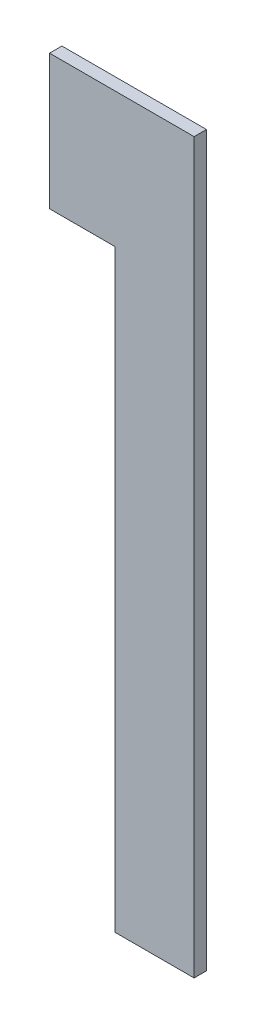
ISO-10303-21;
HEADER;
FILE_DESCRIPTION(('STEP AP214'),'2;1');
FILE_NAME('part.step','',(''),(''),'','','');
FILE_SCHEMA(('AUTOMOTIVE_DESIGN { 1 0 10303 214 1 1 1 1 }'));
ENDSEC;
DATA;
#1=APPLICATION_CONTEXT('core data for automotive mechanical design processes');
#2=APPLICATION_PROTOCOL_DEFINITION('international standard','automotive_design',2000,#1);
#3=PRODUCT_CONTEXT('',#1,'mechanical');
#4=PRODUCT('Part','Part','',(#3));
#5=PRODUCT_RELATED_PRODUCT_CATEGORY('part','',(#4));
#6=PRODUCT_DEFINITION_FORMATION('','',#4);
#7=PRODUCT_DEFINITION_CONTEXT('part definition',#1,'design');
#8=PRODUCT_DEFINITION('design','',#6,#7);
#9=PRODUCT_DEFINITION_SHAPE('','',#8);
#10=(LENGTH_UNIT() NAMED_UNIT(*) SI_UNIT(.MILLI.,.METRE.));
#11=(NAMED_UNIT(*) PLANE_ANGLE_UNIT() SI_UNIT($,.RADIAN.));
#12=(NAMED_UNIT(*) SI_UNIT($,.STERADIAN.) SOLID_ANGLE_UNIT());
#13=UNCERTAINTY_MEASURE_WITH_UNIT(LENGTH_MEASURE(1.E-05),#10,'distance_accuracy_value','');
#14=(GEOMETRIC_REPRESENTATION_CONTEXT(3) GLOBAL_UNCERTAINTY_ASSIGNED_CONTEXT((#13)) GLOBAL_UNIT_ASSIGNED_CONTEXT((#10,
#11,#12)) REPRESENTATION_CONTEXT('',''));
#15=CARTESIAN_POINT('',(0.,0.,0.));
#16=DIRECTION('',(0.,0.,1.));
#17=DIRECTION('',(1.,0.,0.));
#18=AXIS2_PLACEMENT_3D('',#15,#16,#17);
#19=CARTESIAN_POINT('',(0.,0.,-1.17));
#20=DIRECTION('',(-1.,0.,0.));
#21=DIRECTION('',(0.,0.,1.));
#22=AXIS2_PLACEMENT_3D('',#19,#20,#21);
#23=PLANE('',#22);
#24=DIRECTION('',(0.,-1.,0.));
#25=VECTOR('',#24,1.);
#26=CARTESIAN_POINT('',(0.,0.,0.));
#27=LINE('',#26,#25);
#28=CARTESIAN_POINT('',(0.,56.1944777012527,0.));
#29=VERTEX_POINT('',#28);
#30=CARTESIAN_POINT('',(0.,0.,0.));
#31=VERTEX_POINT('',#30);
#32=EDGE_CURVE('E122',#29,#31,#27,.T.);
#33=ORIENTED_EDGE('',*,*,#32,.F.);
#34=DIRECTION('',(0.,0.,1.));
#35=VECTOR('',#34,1.);
#36=CARTESIAN_POINT('',(0.,56.1944777012527,-1.17));
#37=LINE('',#36,#35);
#38=CARTESIAN_POINT('',(0.,56.1944777012527,-1.17));
#39=VERTEX_POINT('',#38);
#40=EDGE_CURVE('E11',#39,#29,#37,.T.);
#41=ORIENTED_EDGE('',*,*,#40,.F.);
#42=DIRECTION('',(0.,-1.,0.));
#43=VECTOR('',#42,1.);
#44=CARTESIAN_POINT('',(0.,0.,-1.17));
#45=LINE('',#44,#43);
#46=CARTESIAN_POINT('',(0.,0.,-1.17));
#47=VERTEX_POINT('',#46);
#48=EDGE_CURVE('E136',#39,#47,#45,.T.);
#49=ORIENTED_EDGE('',*,*,#48,.T.);
#50=DIRECTION('',(0.,0.,1.));
#51=VECTOR('',#50,1.);
#52=CARTESIAN_POINT('',(0.,0.,-1.17));
#53=LINE('',#52,#51);
#54=EDGE_CURVE('E40',#47,#31,#53,.T.);
#55=ORIENTED_EDGE('',*,*,#54,.T.);
#56=EDGE_LOOP('',(#33,#41,#49,#55));
#57=FACE_BOUND('',#56,.T.);
#58=ADVANCED_FACE('F37',(#57),#23,.T.);
#59=CARTESIAN_POINT('',(0.,56.1944777012527,-1.17));
#60=DIRECTION('',(0.,-1.,0.));
#61=DIRECTION('',(0.,0.,-1.));
#62=AXIS2_PLACEMENT_3D('',#59,#60,#61);
#63=PLANE('',#62);
#64=DIRECTION('',(1.,0.,0.));
#65=VECTOR('',#64,1.);
#66=CARTESIAN_POINT('',(0.,56.1944777012527,0.));
#67=LINE('',#66,#65);
#68=CARTESIAN_POINT('',(-6.18258430921038,56.1944777012527,0.));
#69=VERTEX_POINT('',#68);
#70=EDGE_CURVE('E134',#69,#29,#67,.T.);
#71=ORIENTED_EDGE('',*,*,#70,.F.);
#72=DIRECTION('',(0.,0.,1.));
#73=VECTOR('',#72,1.);
#74=CARTESIAN_POINT('',(-6.18258430921038,56.1944777012527,-1.17));
#75=LINE('',#74,#73);
#76=CARTESIAN_POINT('',(-6.18258430921038,56.1944777012527,-1.17));
#77=VERTEX_POINT('',#76);
#78=EDGE_CURVE('E46',#77,#69,#75,.T.);
#79=ORIENTED_EDGE('',*,*,#78,.F.);
#80=DIRECTION('',(1.,0.,0.));
#81=VECTOR('',#80,1.);
#82=CARTESIAN_POINT('',(0.,56.1944777012527,-1.17));
#83=LINE('',#82,#81);
#84=EDGE_CURVE('E112',#77,#39,#83,.T.);
#85=ORIENTED_EDGE('',*,*,#84,.T.);
#86=ORIENTED_EDGE('',*,*,#40,.T.);
#87=EDGE_LOOP('',(#71,#79,#85,#86));
#88=FACE_BOUND('',#87,.T.);
#89=ADVANCED_FACE('F144',(#88),#63,.T.);
#90=CARTESIAN_POINT('',(-6.18258430921038,56.1944777012527,-1.17));
#91=DIRECTION('',(-1.,0.,0.));
#92=DIRECTION('',(0.,0.,1.));
#93=AXIS2_PLACEMENT_3D('',#90,#91,#92);
#94=PLANE('',#93);
#95=DIRECTION('',(0.,-1.,0.));
#96=VECTOR('',#95,1.);
#97=CARTESIAN_POINT('',(-6.18258430921038,56.1944777012527,0.));
#98=LINE('',#97,#96);
#99=CARTESIAN_POINT('',(-6.18258430921038,68.9500000000013,0.));
#100=VERTEX_POINT('',#99);
#101=EDGE_CURVE('E99',#100,#69,#98,.T.);
#102=ORIENTED_EDGE('',*,*,#101,.F.);
#103=DIRECTION('',(0.,0.,1.));
#104=VECTOR('',#103,1.);
#105=CARTESIAN_POINT('',(-6.18258430921038,68.9500000000013,-1.17));
#106=LINE('',#105,#104);
#107=CARTESIAN_POINT('',(-6.18258430921038,68.9500000000013,-1.17));
#108=VERTEX_POINT('',#107);
#109=EDGE_CURVE('E94',#108,#100,#106,.T.);
#110=ORIENTED_EDGE('',*,*,#109,.F.);
#111=DIRECTION('',(0.,-1.,0.));
#112=VECTOR('',#111,1.);
#113=CARTESIAN_POINT('',(-6.18258430921038,56.1944777012527,-1.17));
#114=LINE('',#113,#112);
#115=EDGE_CURVE('E97',#108,#77,#114,.T.);
#116=ORIENTED_EDGE('',*,*,#115,.T.);
#117=ORIENTED_EDGE('',*,*,#78,.T.);
#118=EDGE_LOOP('',(#102,#110,#116,#117));
#119=FACE_BOUND('',#118,.T.);
#120=ADVANCED_FACE('F96',(#119),#94,.T.);
#121=CARTESIAN_POINT('',(-6.18258430921038,68.9500000000013,-1.17));
#122=DIRECTION('',(0.,1.,0.));
#123=DIRECTION('',(0.,0.,1.));
#124=AXIS2_PLACEMENT_3D('',#121,#122,#123);
#125=PLANE('',#124);
#126=DIRECTION('',(-1.,0.,0.));
#127=VECTOR('',#126,1.);
#128=CARTESIAN_POINT('',(-6.18258430921038,68.9500000000013,0.));
#129=LINE('',#128,#127);
#130=CARTESIAN_POINT('',(7.5,68.9500000000013,0.));
#131=VERTEX_POINT('',#130);
#132=EDGE_CURVE('E131',#131,#100,#129,.T.);
#133=ORIENTED_EDGE('',*,*,#132,.F.);
#134=DIRECTION('',(0.,0.,1.));
#135=VECTOR('',#134,1.);
#136=CARTESIAN_POINT('',(7.5,68.9500000000013,-1.17));
#137=LINE('',#136,#135);
#138=CARTESIAN_POINT('',(7.5,68.9500000000013,-1.17));
#139=VERTEX_POINT('',#138);
#140=EDGE_CURVE('E104',#139,#131,#137,.T.);
#141=ORIENTED_EDGE('',*,*,#140,.F.);
#142=DIRECTION('',(-1.,0.,0.));
#143=VECTOR('',#142,1.);
#144=CARTESIAN_POINT('',(-6.18258430921038,68.9500000000013,-1.17));
#145=LINE('',#144,#143);
#146=EDGE_CURVE('E110',#139,#108,#145,.T.);
#147=ORIENTED_EDGE('',*,*,#146,.T.);
#148=ORIENTED_EDGE('',*,*,#109,.T.);
#149=EDGE_LOOP('',(#133,#141,#147,#148));
#150=FACE_BOUND('',#149,.T.);
#151=ADVANCED_FACE('F114',(#150),#125,.T.);
#152=CARTESIAN_POINT('',(7.5,0.,-1.17));
#153=DIRECTION('',(1.,0.,0.));
#154=DIRECTION('',(0.,0.,-1.));
#155=AXIS2_PLACEMENT_3D('',#152,#153,#154);
#156=PLANE('',#155);
#157=DIRECTION('',(0.,1.,0.));
#158=VECTOR('',#157,1.);
#159=CARTESIAN_POINT('',(7.5,0.,0.));
#160=LINE('',#159,#158);
#161=CARTESIAN_POINT('',(7.5,0.,0.));
#162=VERTEX_POINT('',#161);
#163=EDGE_CURVE('E128',#162,#131,#160,.T.);
#164=ORIENTED_EDGE('',*,*,#163,.F.);
#165=DIRECTION('',(0.,0.,1.));
#166=VECTOR('',#165,1.);
#167=CARTESIAN_POINT('',(7.5,0.,-1.17));
#168=LINE('',#167,#166);
#169=CARTESIAN_POINT('',(7.5,0.,-1.17));
#170=VERTEX_POINT('',#169);
#171=EDGE_CURVE('E139',#170,#162,#168,.T.);
#172=ORIENTED_EDGE('',*,*,#171,.F.);
#173=DIRECTION('',(0.,1.,0.));
#174=VECTOR('',#173,1.);
#175=CARTESIAN_POINT('',(7.5,0.,-1.17));
#176=LINE('',#175,#174);
#177=EDGE_CURVE('E115',#170,#139,#176,.T.);
#178=ORIENTED_EDGE('',*,*,#177,.T.);
#179=ORIENTED_EDGE('',*,*,#140,.T.);
#180=EDGE_LOOP('',(#164,#172,#178,#179));
#181=FACE_BOUND('',#180,.T.);
#182=ADVANCED_FACE('F157',(#181),#156,.T.);
#183=CARTESIAN_POINT('',(0.,0.,-1.17));
#184=DIRECTION('',(0.,-1.,0.));
#185=DIRECTION('',(0.,0.,-1.));
#186=AXIS2_PLACEMENT_3D('',#183,#184,#185);
#187=PLANE('',#186);
#188=DIRECTION('',(1.,0.,0.));
#189=VECTOR('',#188,1.);
#190=CARTESIAN_POINT('',(0.,0.,0.));
#191=LINE('',#190,#189);
#192=EDGE_CURVE('E125',#31,#162,#191,.T.);
#193=ORIENTED_EDGE('',*,*,#192,.F.);
#194=ORIENTED_EDGE('',*,*,#54,.F.);
#195=DIRECTION('',(1.,0.,0.));
#196=VECTOR('',#195,1.);
#197=CARTESIAN_POINT('',(0.,0.,-1.17));
#198=LINE('',#197,#196);
#199=EDGE_CURVE('E117',#47,#170,#198,.T.);
#200=ORIENTED_EDGE('',*,*,#199,.T.);
#201=ORIENTED_EDGE('',*,*,#171,.T.);
#202=EDGE_LOOP('',(#193,#194,#200,#201));
#203=FACE_BOUND('',#202,.T.);
#204=ADVANCED_FACE('F141',(#203),#187,.T.);
#205=CARTESIAN_POINT('',(0.,0.,-1.17));
#206=DIRECTION('',(0.,0.,1.));
#207=DIRECTION('',(1.,0.,0.));
#208=AXIS2_PLACEMENT_3D('',#205,#206,#207);
#209=PLANE('',#208);
#210=ORIENTED_EDGE('',*,*,#48,.F.);
#211=ORIENTED_EDGE('',*,*,#84,.F.);
#212=ORIENTED_EDGE('',*,*,#115,.F.);
#213=ORIENTED_EDGE('',*,*,#146,.F.);
#214=ORIENTED_EDGE('',*,*,#177,.F.);
#215=ORIENTED_EDGE('',*,*,#199,.F.);
#216=EDGE_LOOP('',(#210,#211,#212,#213,#214,#215));
#217=FACE_BOUND('',#216,.T.);
#218=ADVANCED_FACE('F108',(#217),#209,.F.);
#219=CARTESIAN_POINT('',(0.,0.,0.));
#220=DIRECTION('',(0.,0.,1.));
#221=DIRECTION('',(1.,0.,0.));
#222=AXIS2_PLACEMENT_3D('',#219,#220,#221);
#223=PLANE('',#222);
#224=ORIENTED_EDGE('',*,*,#32,.T.);
#225=ORIENTED_EDGE('',*,*,#192,.T.);
#226=ORIENTED_EDGE('',*,*,#163,.T.);
#227=ORIENTED_EDGE('',*,*,#132,.T.);
#228=ORIENTED_EDGE('',*,*,#101,.T.);
#229=ORIENTED_EDGE('',*,*,#70,.T.);
#230=EDGE_LOOP('',(#224,#225,#226,#227,#228,#229));
#231=FACE_BOUND('',#230,.T.);
#232=ADVANCED_FACE('F143',(#231),#223,.T.);
#233=CLOSED_SHELL('',(#58,#89,#120,#151,#182,#204,#218,#232));
#234=MANIFOLD_SOLID_BREP('B2',#233);
#235=ADVANCED_BREP_SHAPE_REPRESENTATION('',(#18,#234),#14);
#236=SHAPE_DEFINITION_REPRESENTATION(#9,#235);
ENDSEC;
END-ISO-10303-21;
